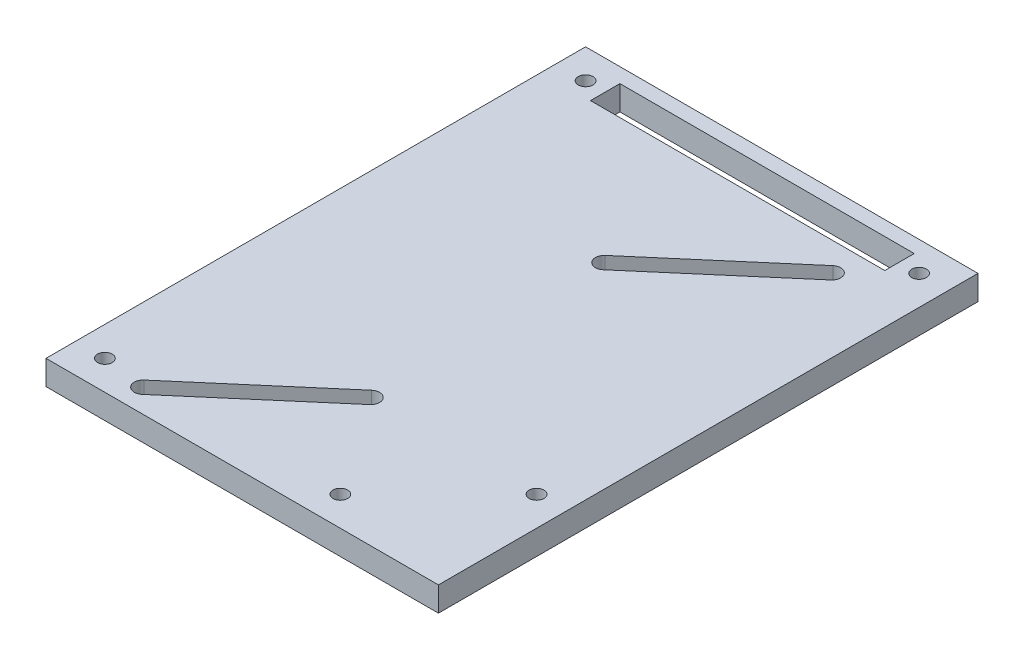
ISO-10303-21;
HEADER;
FILE_DESCRIPTION(('STEP AP214'),'2;1');
FILE_NAME('part.step','',(''),(''),'','','');
FILE_SCHEMA(('AUTOMOTIVE_DESIGN { 1 0 10303 214 1 1 1 1 }'));
ENDSEC;
DATA;
#1=APPLICATION_CONTEXT('core data for automotive mechanical design processes');
#2=APPLICATION_PROTOCOL_DEFINITION('international standard','automotive_design',2000,#1);
#3=PRODUCT_CONTEXT('',#1,'mechanical');
#4=PRODUCT('Part','Part','',(#3));
#5=PRODUCT_RELATED_PRODUCT_CATEGORY('part','',(#4));
#6=PRODUCT_DEFINITION_FORMATION('','',#4);
#7=PRODUCT_DEFINITION_CONTEXT('part definition',#1,'design');
#8=PRODUCT_DEFINITION('design','',#6,#7);
#9=PRODUCT_DEFINITION_SHAPE('','',#8);
#10=(LENGTH_UNIT() NAMED_UNIT(*) SI_UNIT(.MILLI.,.METRE.));
#11=(NAMED_UNIT(*) PLANE_ANGLE_UNIT() SI_UNIT($,.RADIAN.));
#12=(NAMED_UNIT(*) SI_UNIT($,.STERADIAN.) SOLID_ANGLE_UNIT());
#13=UNCERTAINTY_MEASURE_WITH_UNIT(LENGTH_MEASURE(1.E-05),#10,'distance_accuracy_value','');
#14=(GEOMETRIC_REPRESENTATION_CONTEXT(3) GLOBAL_UNCERTAINTY_ASSIGNED_CONTEXT((#13)) GLOBAL_UNIT_ASSIGNED_CONTEXT((#10,
#11,#12)) REPRESENTATION_CONTEXT('',''));
#15=CARTESIAN_POINT('',(0.,0.,0.));
#16=DIRECTION('',(0.,0.,1.));
#17=DIRECTION('',(1.,0.,0.));
#18=AXIS2_PLACEMENT_3D('',#15,#16,#17);
#19=CARTESIAN_POINT('',(-50.8,6.35,63.5));
#20=DIRECTION('',(1.,0.,0.));
#21=DIRECTION('',(0.,0.,-1.));
#22=AXIS2_PLACEMENT_3D('',#19,#20,#21);
#23=PLANE('',#22);
#24=DIRECTION('',(0.,0.,1.));
#25=VECTOR('',#24,1.);
#26=CARTESIAN_POINT('',(-50.8,0.,63.5));
#27=LINE('',#26,#25);
#28=CARTESIAN_POINT('',(-50.8,0.,-76.2));
#29=VERTEX_POINT('',#28);
#30=CARTESIAN_POINT('',(-50.8,0.,63.5));
#31=VERTEX_POINT('',#30);
#32=EDGE_CURVE('E213',#29,#31,#27,.T.);
#33=ORIENTED_EDGE('',*,*,#32,.T.);
#34=DIRECTION('',(0.,-1.,0.));
#35=VECTOR('',#34,1.);
#36=CARTESIAN_POINT('',(-50.8,6.35,63.5));
#37=LINE('',#36,#35);
#38=CARTESIAN_POINT('',(-50.8,6.35,63.5));
#39=VERTEX_POINT('',#38);
#40=EDGE_CURVE('E11',#39,#31,#37,.T.);
#41=ORIENTED_EDGE('',*,*,#40,.F.);
#42=DIRECTION('',(0.,0.,1.));
#43=VECTOR('',#42,1.);
#44=CARTESIAN_POINT('',(-50.8,6.35,63.5));
#45=LINE('',#44,#43);
#46=CARTESIAN_POINT('',(-50.8,6.35,-76.2));
#47=VERTEX_POINT('',#46);
#48=EDGE_CURVE('E250',#47,#39,#45,.T.);
#49=ORIENTED_EDGE('',*,*,#48,.F.);
#50=DIRECTION('',(0.,-1.,0.));
#51=VECTOR('',#50,1.);
#52=CARTESIAN_POINT('',(-50.8,6.35,-76.2));
#53=LINE('',#52,#51);
#54=EDGE_CURVE('E260',#47,#29,#53,.T.);
#55=ORIENTED_EDGE('',*,*,#54,.T.);
#56=EDGE_LOOP('',(#33,#41,#49,#55));
#57=FACE_BOUND('',#56,.T.);
#58=ADVANCED_FACE('F33',(#57),#23,.F.);
#59=CARTESIAN_POINT('',(-50.8,6.35,63.5));
#60=DIRECTION('',(0.,0.,-1.));
#61=DIRECTION('',(-1.,0.,0.));
#62=AXIS2_PLACEMENT_3D('',#59,#60,#61);
#63=PLANE('',#62);
#64=DIRECTION('',(1.,0.,0.));
#65=VECTOR('',#64,1.);
#66=CARTESIAN_POINT('',(-50.8,0.,63.5));
#67=LINE('',#66,#65);
#68=CARTESIAN_POINT('',(50.8,0.,63.5));
#69=VERTEX_POINT('',#68);
#70=EDGE_CURVE('E263',#31,#69,#67,.T.);
#71=ORIENTED_EDGE('',*,*,#70,.T.);
#72=DIRECTION('',(0.,-1.,0.));
#73=VECTOR('',#72,1.);
#74=CARTESIAN_POINT('',(50.8,6.35,63.5));
#75=LINE('',#74,#73);
#76=CARTESIAN_POINT('',(50.8,6.35,63.5));
#77=VERTEX_POINT('',#76);
#78=EDGE_CURVE('E40',#77,#69,#75,.T.);
#79=ORIENTED_EDGE('',*,*,#78,.F.);
#80=DIRECTION('',(1.,0.,0.));
#81=VECTOR('',#80,1.);
#82=CARTESIAN_POINT('',(-50.8,6.35,63.5));
#83=LINE('',#82,#81);
#84=EDGE_CURVE('E253',#39,#77,#83,.T.);
#85=ORIENTED_EDGE('',*,*,#84,.F.);
#86=ORIENTED_EDGE('',*,*,#40,.T.);
#87=EDGE_LOOP('',(#71,#79,#85,#86));
#88=FACE_BOUND('',#87,.T.);
#89=ADVANCED_FACE('F292',(#88),#63,.F.);
#90=CARTESIAN_POINT('',(50.8,6.35,63.5));
#91=DIRECTION('',(-1.,0.,0.));
#92=DIRECTION('',(0.,0.,1.));
#93=AXIS2_PLACEMENT_3D('',#90,#91,#92);
#94=PLANE('',#93);
#95=DIRECTION('',(0.,0.,-1.));
#96=VECTOR('',#95,1.);
#97=CARTESIAN_POINT('',(50.8,0.,63.5));
#98=LINE('',#97,#96);
#99=CARTESIAN_POINT('',(50.8,0.,-76.2));
#100=VERTEX_POINT('',#99);
#101=EDGE_CURVE('E265',#69,#100,#98,.T.);
#102=ORIENTED_EDGE('',*,*,#101,.T.);
#103=DIRECTION('',(0.,-1.,0.));
#104=VECTOR('',#103,1.);
#105=CARTESIAN_POINT('',(50.8,6.35,-76.2));
#106=LINE('',#105,#104);
#107=CARTESIAN_POINT('',(50.8,6.35,-76.2));
#108=VERTEX_POINT('',#107);
#109=EDGE_CURVE('E270',#108,#100,#106,.T.);
#110=ORIENTED_EDGE('',*,*,#109,.F.);
#111=DIRECTION('',(0.,0.,-1.));
#112=VECTOR('',#111,1.);
#113=CARTESIAN_POINT('',(50.8,6.35,63.5));
#114=LINE('',#113,#112);
#115=EDGE_CURVE('E256',#77,#108,#114,.T.);
#116=ORIENTED_EDGE('',*,*,#115,.F.);
#117=ORIENTED_EDGE('',*,*,#78,.T.);
#118=EDGE_LOOP('',(#102,#110,#116,#117));
#119=FACE_BOUND('',#118,.T.);
#120=ADVANCED_FACE('F277',(#119),#94,.F.);
#121=CARTESIAN_POINT('',(-50.8,6.35,-76.2));
#122=DIRECTION('',(0.,0.,1.));
#123=DIRECTION('',(1.,0.,0.));
#124=AXIS2_PLACEMENT_3D('',#121,#122,#123);
#125=PLANE('',#124);
#126=DIRECTION('',(-1.,0.,0.));
#127=VECTOR('',#126,1.);
#128=CARTESIAN_POINT('',(-50.8,0.,-76.2));
#129=LINE('',#128,#127);
#130=EDGE_CURVE('E254',#100,#29,#129,.T.);
#131=ORIENTED_EDGE('',*,*,#130,.T.);
#132=ORIENTED_EDGE('',*,*,#54,.F.);
#133=DIRECTION('',(-1.,0.,0.));
#134=VECTOR('',#133,1.);
#135=CARTESIAN_POINT('',(-50.8,6.35,-76.2));
#136=LINE('',#135,#134);
#137=EDGE_CURVE('E258',#108,#47,#136,.T.);
#138=ORIENTED_EDGE('',*,*,#137,.F.);
#139=ORIENTED_EDGE('',*,*,#109,.T.);
#140=EDGE_LOOP('',(#131,#132,#138,#139));
#141=FACE_BOUND('',#140,.T.);
#142=ADVANCED_FACE('F285',(#141),#125,.F.);
#143=CARTESIAN_POINT('',(0.,6.35,0.));
#144=DIRECTION('',(0.,-1.,0.));
#145=DIRECTION('',(0.,0.,-1.));
#146=AXIS2_PLACEMENT_3D('',#143,#144,#145);
#147=PLANE('',#146);
#148=CARTESIAN_POINT('',(43.18,6.35,-68.58));
#149=DIRECTION('',(0.,1.,0.));
#150=DIRECTION('',(0.,0.,-1.));
#151=AXIS2_PLACEMENT_3D('',#148,#149,#150);
#152=CIRCLE('',#151,1.905);
#153=CARTESIAN_POINT('',(43.18,6.35,-70.485));
#154=VERTEX_POINT('',#153);
#155=EDGE_CURVE('E393',#154,#154,#152,.T.);
#156=ORIENTED_EDGE('',*,*,#155,.F.);
#157=EDGE_LOOP('',(#156));
#158=FACE_BOUND('',#157,.T.);
#159=CARTESIAN_POINT('',(-43.18,6.35,55.88));
#160=DIRECTION('',(0.,1.,0.));
#161=DIRECTION('',(0.,0.,1.));
#162=AXIS2_PLACEMENT_3D('',#159,#160,#161);
#163=CIRCLE('',#162,1.905);
#164=CARTESIAN_POINT('',(-43.18,6.35,57.785));
#165=VERTEX_POINT('',#164);
#166=EDGE_CURVE('E382',#165,#165,#163,.T.);
#167=ORIENTED_EDGE('',*,*,#166,.F.);
#168=EDGE_LOOP('',(#167));
#169=FACE_BOUND('',#168,.T.);
#170=CARTESIAN_POINT('',(17.78,6.35,55.88));
#171=DIRECTION('',(0.,1.,0.));
#172=DIRECTION('',(0.,0.,1.));
#173=AXIS2_PLACEMENT_3D('',#170,#171,#172);
#174=CIRCLE('',#173,1.905);
#175=CARTESIAN_POINT('',(17.78,6.35,57.785));
#176=VERTEX_POINT('',#175);
#177=EDGE_CURVE('E378',#176,#176,#174,.T.);
#178=ORIENTED_EDGE('',*,*,#177,.F.);
#179=EDGE_LOOP('',(#178));
#180=FACE_BOUND('',#179,.T.);
#181=CARTESIAN_POINT('',(43.18,6.35,30.48));
#182=DIRECTION('',(0.,1.,0.));
#183=DIRECTION('',(0.,0.,-1.));
#184=AXIS2_PLACEMENT_3D('',#181,#182,#183);
#185=CIRCLE('',#184,1.905);
#186=CARTESIAN_POINT('',(43.18,6.35,28.575));
#187=VERTEX_POINT('',#186);
#188=EDGE_CURVE('E385',#187,#187,#185,.T.);
#189=ORIENTED_EDGE('',*,*,#188,.F.);
#190=EDGE_LOOP('',(#189));
#191=FACE_BOUND('',#190,.T.);
#192=CARTESIAN_POINT('',(-43.18,6.35,-68.58));
#193=DIRECTION('',(0.,1.,0.));
#194=DIRECTION('',(0.,0.,1.));
#195=AXIS2_PLACEMENT_3D('',#192,#193,#194);
#196=CIRCLE('',#195,1.905);
#197=CARTESIAN_POINT('',(-43.18,6.35,-66.675));
#198=VERTEX_POINT('',#197);
#199=EDGE_CURVE('E169',#198,#198,#196,.T.);
#200=ORIENTED_EDGE('',*,*,#199,.F.);
#201=EDGE_LOOP('',(#200));
#202=FACE_BOUND('',#201,.T.);
#203=DIRECTION('',(-1.,0.,0.));
#204=VECTOR('',#203,1.);
#205=CARTESIAN_POINT('',(-38.1,6.35,-72.39));
#206=LINE('',#205,#204);
#207=CARTESIAN_POINT('',(38.1,6.35,-72.39));
#208=VERTEX_POINT('',#207);
#209=CARTESIAN_POINT('',(-38.1,6.35,-72.39));
#210=VERTEX_POINT('',#209);
#211=EDGE_CURVE('E175',#208,#210,#206,.T.);
#212=ORIENTED_EDGE('',*,*,#211,.F.);
#213=DIRECTION('',(0.,0.,-1.));
#214=VECTOR('',#213,1.);
#215=CARTESIAN_POINT('',(38.1,6.35,-64.77));
#216=LINE('',#215,#214);
#217=CARTESIAN_POINT('',(38.1,6.35,-64.77));
#218=VERTEX_POINT('',#217);
#219=EDGE_CURVE('E47',#218,#208,#216,.T.);
#220=ORIENTED_EDGE('',*,*,#219,.F.);
#221=DIRECTION('',(1.,0.,0.));
#222=VECTOR('',#221,1.);
#223=CARTESIAN_POINT('',(-38.1,6.35,-64.77));
#224=LINE('',#223,#222);
#225=CARTESIAN_POINT('',(-38.1,6.35,-64.77));
#226=VERTEX_POINT('',#225);
#227=EDGE_CURVE('E163',#226,#218,#224,.T.);
#228=ORIENTED_EDGE('',*,*,#227,.F.);
#229=DIRECTION('',(0.,0.,1.));
#230=VECTOR('',#229,1.);
#231=CARTESIAN_POINT('',(-38.1,6.35,-64.77));
#232=LINE('',#231,#230);
#233=EDGE_CURVE('E166',#210,#226,#232,.T.);
#234=ORIENTED_EDGE('',*,*,#233,.F.);
#235=EDGE_LOOP('',(#212,#220,#228,#234));
#236=FACE_BOUND('',#235,.T.);
#237=DIRECTION('',(0.759685436236599,0.,-0.650290733418529));
#238=VECTOR('',#237,1.);
#239=CARTESIAN_POINT('',(1.48656461659475,6.35,-28.4893590927631));
#240=LINE('',#239,#238);
#241=CARTESIAN_POINT('',(1.48656461659475,6.35,-28.4893590927631));
#242=VERTEX_POINT('',#241);
#243=CARTESIAN_POINT('',(33.2365646165948,6.35,-55.6673590927631));
#244=VERTEX_POINT('',#243);
#245=EDGE_CURVE('E202',#242,#244,#240,.T.);
#246=ORIENTED_EDGE('',*,*,#245,.F.);
#247=CARTESIAN_POINT('',(0.,6.35,-30.226));
#248=DIRECTION('',(0.,1.,0.));
#249=DIRECTION('',(0.,0.,1.));
#250=AXIS2_PLACEMENT_3D('',#247,#248,#249);
#251=CIRCLE('',#250,2.28599999999999);
#252=CARTESIAN_POINT('',(-1.48656461659475,6.35,-31.9626409072369));
#253=VERTEX_POINT('',#252);
#254=EDGE_CURVE('E200',#253,#242,#251,.T.);
#255=ORIENTED_EDGE('',*,*,#254,.F.);
#256=DIRECTION('',(-0.759685436236599,0.,0.650290733418529));
#257=VECTOR('',#256,1.);
#258=CARTESIAN_POINT('',(-1.48656461659475,6.35,-31.9626409072369));
#259=LINE('',#258,#257);
#260=CARTESIAN_POINT('',(30.2634353834052,6.35,-59.1406409072369));
#261=VERTEX_POINT('',#260);
#262=EDGE_CURVE('E190',#261,#253,#259,.T.);
#263=ORIENTED_EDGE('',*,*,#262,.F.);
#264=CARTESIAN_POINT('',(31.75,6.35,-57.404));
#265=DIRECTION('',(0.,1.,0.));
#266=DIRECTION('',(0.,0.,1.));
#267=AXIS2_PLACEMENT_3D('',#264,#265,#266);
#268=CIRCLE('',#267,2.28600000000001);
#269=EDGE_CURVE('E206',#244,#261,#268,.T.);
#270=ORIENTED_EDGE('',*,*,#269,.F.);
#271=EDGE_LOOP('',(#246,#255,#263,#270));
#272=FACE_BOUND('',#271,.T.);
#273=DIRECTION('',(-0.75968543623666,0.,0.650290733418458));
#274=VECTOR('',#273,1.);
#275=CARTESIAN_POINT('',(-1.48656461659495,6.35,28.4893590927631));
#276=LINE('',#275,#274);
#277=CARTESIAN_POINT('',(-1.48656461659495,6.35,28.4893590927631));
#278=VERTEX_POINT('',#277);
#279=CARTESIAN_POINT('',(-33.2365646165973,6.35,55.6673590927601));
#280=VERTEX_POINT('',#279);
#281=EDGE_CURVE('E235',#278,#280,#276,.T.);
#282=ORIENTED_EDGE('',*,*,#281,.F.);
#283=CARTESIAN_POINT('',(-2.11067029895745E-13,6.35,30.226));
#284=DIRECTION('',(0.,1.,0.));
#285=DIRECTION('',(0.,0.,1.));
#286=AXIS2_PLACEMENT_3D('',#283,#284,#285);
#287=CIRCLE('',#286,2.28599999999999);
#288=CARTESIAN_POINT('',(1.48656461659453,6.35,31.9626409072369));
#289=VERTEX_POINT('',#288);
#290=EDGE_CURVE('E182',#289,#278,#287,.T.);
#291=ORIENTED_EDGE('',*,*,#290,.F.);
#292=DIRECTION('',(0.759685436236659,0.,-0.650290733418459));
#293=VECTOR('',#292,1.);
#294=CARTESIAN_POINT('',(1.48656461659453,6.35,31.9626409072369));
#295=LINE('',#294,#293);
#296=CARTESIAN_POINT('',(-30.2634353834081,6.35,59.1406409072341));
#297=VERTEX_POINT('',#296);
#298=EDGE_CURVE('E224',#297,#289,#295,.T.);
#299=ORIENTED_EDGE('',*,*,#298,.F.);
#300=CARTESIAN_POINT('',(-31.7500000000027,6.35,57.4039999999971));
#301=DIRECTION('',(0.,1.,0.));
#302=DIRECTION('',(0.,0.,1.));
#303=AXIS2_PLACEMENT_3D('',#300,#301,#302);
#304=CIRCLE('',#303,2.28600000000001);
#305=EDGE_CURVE('E238',#280,#297,#304,.T.);
#306=ORIENTED_EDGE('',*,*,#305,.F.);
#307=EDGE_LOOP('',(#282,#291,#299,#306));
#308=FACE_BOUND('',#307,.T.);
#309=ORIENTED_EDGE('',*,*,#48,.T.);
#310=ORIENTED_EDGE('',*,*,#84,.T.);
#311=ORIENTED_EDGE('',*,*,#115,.T.);
#312=ORIENTED_EDGE('',*,*,#137,.T.);
#313=EDGE_LOOP('',(#309,#310,#311,#312));
#314=FACE_BOUND('',#313,.T.);
#315=ADVANCED_FACE('F291',(#158,#169,#180,#191,#202,#236,#272,#308,#314),#147,.F.);
#316=CARTESIAN_POINT('',(0.,0.,0.));
#317=DIRECTION('',(0.,-1.,0.));
#318=DIRECTION('',(0.,0.,-1.));
#319=AXIS2_PLACEMENT_3D('',#316,#317,#318);
#320=PLANE('',#319);
#321=CARTESIAN_POINT('',(43.18,0.,-68.58));
#322=DIRECTION('',(0.,1.,0.));
#323=DIRECTION('',(0.,0.,-1.));
#324=AXIS2_PLACEMENT_3D('',#321,#322,#323);
#325=CIRCLE('',#324,1.905);
#326=CARTESIAN_POINT('',(43.18,0.,-70.485));
#327=VERTEX_POINT('',#326);
#328=EDGE_CURVE('E390',#327,#327,#325,.T.);
#329=ORIENTED_EDGE('',*,*,#328,.T.);
#330=EDGE_LOOP('',(#329));
#331=FACE_BOUND('',#330,.T.);
#332=CARTESIAN_POINT('',(-43.18,0.,55.88));
#333=DIRECTION('',(0.,1.,0.));
#334=DIRECTION('',(0.,0.,1.));
#335=AXIS2_PLACEMENT_3D('',#332,#333,#334);
#336=CIRCLE('',#335,1.905);
#337=CARTESIAN_POINT('',(-43.18,0.,57.785));
#338=VERTEX_POINT('',#337);
#339=EDGE_CURVE('E396',#338,#338,#336,.T.);
#340=ORIENTED_EDGE('',*,*,#339,.T.);
#341=EDGE_LOOP('',(#340));
#342=FACE_BOUND('',#341,.T.);
#343=CARTESIAN_POINT('',(17.78,0.,55.88));
#344=DIRECTION('',(0.,1.,0.));
#345=DIRECTION('',(0.,0.,1.));
#346=AXIS2_PLACEMENT_3D('',#343,#344,#345);
#347=CIRCLE('',#346,1.905);
#348=CARTESIAN_POINT('',(17.78,0.,57.785));
#349=VERTEX_POINT('',#348);
#350=EDGE_CURVE('E375',#349,#349,#347,.T.);
#351=ORIENTED_EDGE('',*,*,#350,.T.);
#352=EDGE_LOOP('',(#351));
#353=FACE_BOUND('',#352,.T.);
#354=CARTESIAN_POINT('',(43.18,0.,30.48));
#355=DIRECTION('',(0.,1.,0.));
#356=DIRECTION('',(0.,0.,-1.));
#357=AXIS2_PLACEMENT_3D('',#354,#355,#356);
#358=CIRCLE('',#357,1.905);
#359=CARTESIAN_POINT('',(43.18,0.,28.575));
#360=VERTEX_POINT('',#359);
#361=EDGE_CURVE('E380',#360,#360,#358,.T.);
#362=ORIENTED_EDGE('',*,*,#361,.T.);
#363=EDGE_LOOP('',(#362));
#364=FACE_BOUND('',#363,.T.);
#365=CARTESIAN_POINT('',(-43.18,0.,-68.58));
#366=DIRECTION('',(0.,1.,0.));
#367=DIRECTION('',(0.,0.,1.));
#368=AXIS2_PLACEMENT_3D('',#365,#366,#367);
#369=CIRCLE('',#368,1.905);
#370=CARTESIAN_POINT('',(-43.18,0.,-66.675));
#371=VERTEX_POINT('',#370);
#372=EDGE_CURVE('E176',#371,#371,#369,.T.);
#373=ORIENTED_EDGE('',*,*,#372,.T.);
#374=EDGE_LOOP('',(#373));
#375=FACE_BOUND('',#374,.T.);
#376=DIRECTION('',(0.,0.,-1.));
#377=VECTOR('',#376,1.);
#378=CARTESIAN_POINT('',(38.1,0.,-64.77));
#379=LINE('',#378,#377);
#380=CARTESIAN_POINT('',(38.1,0.,-64.77));
#381=VERTEX_POINT('',#380);
#382=CARTESIAN_POINT('',(38.1,0.,-72.39));
#383=VERTEX_POINT('',#382);
#384=EDGE_CURVE('E147',#381,#383,#379,.T.);
#385=ORIENTED_EDGE('',*,*,#384,.T.);
#386=DIRECTION('',(-1.,0.,0.));
#387=VECTOR('',#386,1.);
#388=CARTESIAN_POINT('',(-38.1,0.,-72.39));
#389=LINE('',#388,#387);
#390=CARTESIAN_POINT('',(-38.1,0.,-72.39));
#391=VERTEX_POINT('',#390);
#392=EDGE_CURVE('E156',#383,#391,#389,.T.);
#393=ORIENTED_EDGE('',*,*,#392,.T.);
#394=DIRECTION('',(0.,0.,1.));
#395=VECTOR('',#394,1.);
#396=CARTESIAN_POINT('',(-38.1,0.,-64.77));
#397=LINE('',#396,#395);
#398=CARTESIAN_POINT('',(-38.1,0.,-64.77));
#399=VERTEX_POINT('',#398);
#400=EDGE_CURVE('E55',#391,#399,#397,.T.);
#401=ORIENTED_EDGE('',*,*,#400,.T.);
#402=DIRECTION('',(1.,0.,0.));
#403=VECTOR('',#402,1.);
#404=CARTESIAN_POINT('',(-38.1,0.,-64.77));
#405=LINE('',#404,#403);
#406=EDGE_CURVE('E153',#399,#381,#405,.T.);
#407=ORIENTED_EDGE('',*,*,#406,.T.);
#408=EDGE_LOOP('',(#385,#393,#401,#407));
#409=FACE_BOUND('',#408,.T.);
#410=CARTESIAN_POINT('',(0.,0.,-30.226));
#411=DIRECTION('',(0.,1.,0.));
#412=DIRECTION('',(0.,0.,1.));
#413=AXIS2_PLACEMENT_3D('',#410,#411,#412);
#414=CIRCLE('',#413,2.28599999999999);
#415=CARTESIAN_POINT('',(-1.48656461659475,0.,-31.9626409072369));
#416=VERTEX_POINT('',#415);
#417=CARTESIAN_POINT('',(1.48656461659475,0.,-28.4893590927631));
#418=VERTEX_POINT('',#417);
#419=EDGE_CURVE('E186',#416,#418,#414,.T.);
#420=ORIENTED_EDGE('',*,*,#419,.T.);
#421=DIRECTION('',(0.759685436236599,0.,-0.650290733418529));
#422=VECTOR('',#421,1.);
#423=CARTESIAN_POINT('',(1.48656461659475,0.,-28.4893590927631));
#424=LINE('',#423,#422);
#425=CARTESIAN_POINT('',(33.2365646165948,0.,-55.6673590927631));
#426=VERTEX_POINT('',#425);
#427=EDGE_CURVE('E189',#418,#426,#424,.T.);
#428=ORIENTED_EDGE('',*,*,#427,.T.);
#429=CARTESIAN_POINT('',(31.75,0.,-57.404));
#430=DIRECTION('',(0.,1.,0.));
#431=DIRECTION('',(0.,0.,1.));
#432=AXIS2_PLACEMENT_3D('',#429,#430,#431);
#433=CIRCLE('',#432,2.28600000000001);
#434=CARTESIAN_POINT('',(30.2634353834052,0.,-59.1406409072369));
#435=VERTEX_POINT('',#434);
#436=EDGE_CURVE('E193',#426,#435,#433,.T.);
#437=ORIENTED_EDGE('',*,*,#436,.T.);
#438=DIRECTION('',(-0.759685436236599,0.,0.650290733418529));
#439=VECTOR('',#438,1.);
#440=CARTESIAN_POINT('',(-1.48656461659475,0.,-31.9626409072369));
#441=LINE('',#440,#439);
#442=EDGE_CURVE('E196',#435,#416,#441,.T.);
#443=ORIENTED_EDGE('',*,*,#442,.T.);
#444=EDGE_LOOP('',(#420,#428,#437,#443));
#445=FACE_BOUND('',#444,.T.);
#446=CARTESIAN_POINT('',(-2.11067029895745E-13,0.,30.226));
#447=DIRECTION('',(0.,1.,0.));
#448=DIRECTION('',(0.,0.,1.));
#449=AXIS2_PLACEMENT_3D('',#446,#447,#448);
#450=CIRCLE('',#449,2.28599999999999);
#451=CARTESIAN_POINT('',(1.48656461659453,0.,31.9626409072369));
#452=VERTEX_POINT('',#451);
#453=CARTESIAN_POINT('',(-1.48656461659495,0.,28.4893590927631));
#454=VERTEX_POINT('',#453);
#455=EDGE_CURVE('E220',#452,#454,#450,.T.);
#456=ORIENTED_EDGE('',*,*,#455,.T.);
#457=DIRECTION('',(-0.75968543623666,0.,0.650290733418458));
#458=VECTOR('',#457,1.);
#459=CARTESIAN_POINT('',(-1.48656461659495,0.,28.4893590927631));
#460=LINE('',#459,#458);
#461=CARTESIAN_POINT('',(-33.2365646165973,0.,55.6673590927601));
#462=VERTEX_POINT('',#461);
#463=EDGE_CURVE('E223',#454,#462,#460,.T.);
#464=ORIENTED_EDGE('',*,*,#463,.T.);
#465=CARTESIAN_POINT('',(-31.7500000000027,0.,57.4039999999971));
#466=DIRECTION('',(0.,1.,0.));
#467=DIRECTION('',(0.,0.,1.));
#468=AXIS2_PLACEMENT_3D('',#465,#466,#467);
#469=CIRCLE('',#468,2.28600000000001);
#470=CARTESIAN_POINT('',(-30.2634353834081,0.,59.1406409072341));
#471=VERTEX_POINT('',#470);
#472=EDGE_CURVE('E227',#462,#471,#469,.T.);
#473=ORIENTED_EDGE('',*,*,#472,.T.);
#474=DIRECTION('',(0.759685436236659,0.,-0.650290733418459));
#475=VECTOR('',#474,1.);
#476=CARTESIAN_POINT('',(1.48656461659453,0.,31.9626409072369));
#477=LINE('',#476,#475);
#478=EDGE_CURVE('E230',#471,#452,#477,.T.);
#479=ORIENTED_EDGE('',*,*,#478,.T.);
#480=EDGE_LOOP('',(#456,#464,#473,#479));
#481=FACE_BOUND('',#480,.T.);
#482=ORIENTED_EDGE('',*,*,#32,.F.);
#483=ORIENTED_EDGE('',*,*,#130,.F.);
#484=ORIENTED_EDGE('',*,*,#101,.F.);
#485=ORIENTED_EDGE('',*,*,#70,.F.);
#486=EDGE_LOOP('',(#482,#483,#484,#485));
#487=FACE_BOUND('',#486,.T.);
#488=ADVANCED_FACE('F160',(#331,#342,#353,#364,#375,#409,#445,#481,#487),#320,.T.);
#489=CARTESIAN_POINT('',(-2.11067029895745E-13,0.,30.226));
#490=DIRECTION('',(0.,1.,0.));
#491=DIRECTION('',(0.,0.,1.));
#492=AXIS2_PLACEMENT_3D('',#489,#490,#491);
#493=CYLINDRICAL_SURFACE('',#492,2.28599999999999);
#494=ORIENTED_EDGE('',*,*,#290,.T.);
#495=DIRECTION('',(0.,1.,0.));
#496=VECTOR('',#495,1.);
#497=CARTESIAN_POINT('',(-1.48656461659495,0.,28.4893590927631));
#498=LINE('',#497,#496);
#499=EDGE_CURVE('E233',#454,#278,#498,.T.);
#500=ORIENTED_EDGE('',*,*,#499,.F.);
#501=ORIENTED_EDGE('',*,*,#455,.F.);
#502=DIRECTION('',(0.,1.,0.));
#503=VECTOR('',#502,1.);
#504=CARTESIAN_POINT('',(1.48656461659453,0.,31.9626409072369));
#505=LINE('',#504,#503);
#506=EDGE_CURVE('E203',#452,#289,#505,.T.);
#507=ORIENTED_EDGE('',*,*,#506,.T.);
#508=EDGE_LOOP('',(#494,#500,#501,#507));
#509=FACE_BOUND('',#508,.T.);
#510=ADVANCED_FACE('F304',(#509),#493,.F.);
#511=CARTESIAN_POINT('',(1.48656461659453,0.,31.9626409072369));
#512=DIRECTION('',(0.650290733418459,0.,0.759685436236659));
#513=DIRECTION('',(0.759685436236659,0.,-0.650290733418459));
#514=AXIS2_PLACEMENT_3D('',#511,#512,#513);
#515=PLANE('',#514);
#516=ORIENTED_EDGE('',*,*,#298,.T.);
#517=ORIENTED_EDGE('',*,*,#506,.F.);
#518=ORIENTED_EDGE('',*,*,#478,.F.);
#519=DIRECTION('',(0.,1.,0.));
#520=VECTOR('',#519,1.);
#521=CARTESIAN_POINT('',(-30.2634353834081,0.,59.1406409072341));
#522=LINE('',#521,#520);
#523=EDGE_CURVE('E244',#471,#297,#522,.T.);
#524=ORIENTED_EDGE('',*,*,#523,.T.);
#525=EDGE_LOOP('',(#516,#517,#518,#524));
#526=FACE_BOUND('',#525,.T.);
#527=ADVANCED_FACE('F311',(#526),#515,.F.);
#528=CARTESIAN_POINT('',(-31.7500000000027,0.,57.4039999999971));
#529=DIRECTION('',(0.,1.,0.));
#530=DIRECTION('',(0.,0.,1.));
#531=AXIS2_PLACEMENT_3D('',#528,#529,#530);
#532=CYLINDRICAL_SURFACE('',#531,2.28600000000001);
#533=ORIENTED_EDGE('',*,*,#305,.T.);
#534=ORIENTED_EDGE('',*,*,#523,.F.);
#535=ORIENTED_EDGE('',*,*,#472,.F.);
#536=DIRECTION('',(0.,1.,0.));
#537=VECTOR('',#536,1.);
#538=CARTESIAN_POINT('',(-33.2365646165973,0.,55.6673590927601));
#539=LINE('',#538,#537);
#540=EDGE_CURVE('E246',#462,#280,#539,.T.);
#541=ORIENTED_EDGE('',*,*,#540,.T.);
#542=EDGE_LOOP('',(#533,#534,#535,#541));
#543=FACE_BOUND('',#542,.T.);
#544=ADVANCED_FACE('F317',(#543),#532,.F.);
#545=CARTESIAN_POINT('',(-1.48656461659495,0.,28.4893590927631));
#546=DIRECTION('',(-0.650290733418458,0.,-0.75968543623666));
#547=DIRECTION('',(-0.75968543623666,0.,0.650290733418458));
#548=AXIS2_PLACEMENT_3D('',#545,#546,#547);
#549=PLANE('',#548);
#550=ORIENTED_EDGE('',*,*,#281,.T.);
#551=ORIENTED_EDGE('',*,*,#540,.F.);
#552=ORIENTED_EDGE('',*,*,#463,.F.);
#553=ORIENTED_EDGE('',*,*,#499,.T.);
#554=EDGE_LOOP('',(#550,#551,#552,#553));
#555=FACE_BOUND('',#554,.T.);
#556=ADVANCED_FACE('F313',(#555),#549,.F.);
#557=CARTESIAN_POINT('',(0.,0.,-30.226));
#558=DIRECTION('',(0.,1.,0.));
#559=DIRECTION('',(0.,0.,1.));
#560=AXIS2_PLACEMENT_3D('',#557,#558,#559);
#561=CYLINDRICAL_SURFACE('',#560,2.28599999999999);
#562=ORIENTED_EDGE('',*,*,#254,.T.);
#563=DIRECTION('',(0.,1.,0.));
#564=VECTOR('',#563,1.);
#565=CARTESIAN_POINT('',(1.48656461659475,0.,-28.4893590927631));
#566=LINE('',#565,#564);
#567=EDGE_CURVE('E199',#418,#242,#566,.T.);
#568=ORIENTED_EDGE('',*,*,#567,.F.);
#569=ORIENTED_EDGE('',*,*,#419,.F.);
#570=DIRECTION('',(0.,1.,0.));
#571=VECTOR('',#570,1.);
#572=CARTESIAN_POINT('',(-1.48656461659475,0.,-31.9626409072369));
#573=LINE('',#572,#571);
#574=EDGE_CURVE('E211',#416,#253,#573,.T.);
#575=ORIENTED_EDGE('',*,*,#574,.T.);
#576=EDGE_LOOP('',(#562,#568,#569,#575));
#577=FACE_BOUND('',#576,.T.);
#578=ADVANCED_FACE('F316',(#577),#561,.F.);
#579=CARTESIAN_POINT('',(-1.48656461659475,0.,-31.9626409072369));
#580=DIRECTION('',(-0.650290733418529,0.,-0.759685436236599));
#581=DIRECTION('',(-0.759685436236599,0.,0.650290733418529));
#582=AXIS2_PLACEMENT_3D('',#579,#580,#581);
#583=PLANE('',#582);
#584=ORIENTED_EDGE('',*,*,#262,.T.);
#585=ORIENTED_EDGE('',*,*,#574,.F.);
#586=ORIENTED_EDGE('',*,*,#442,.F.);
#587=DIRECTION('',(0.,1.,0.));
#588=VECTOR('',#587,1.);
#589=CARTESIAN_POINT('',(30.2634353834052,0.,-59.1406409072369));
#590=LINE('',#589,#588);
#591=EDGE_CURVE('E214',#435,#261,#590,.T.);
#592=ORIENTED_EDGE('',*,*,#591,.T.);
#593=EDGE_LOOP('',(#584,#585,#586,#592));
#594=FACE_BOUND('',#593,.T.);
#595=ADVANCED_FACE('F327',(#594),#583,.F.);
#596=CARTESIAN_POINT('',(31.75,0.,-57.404));
#597=DIRECTION('',(0.,1.,0.));
#598=DIRECTION('',(0.,0.,1.));
#599=AXIS2_PLACEMENT_3D('',#596,#597,#598);
#600=CYLINDRICAL_SURFACE('',#599,2.28600000000001);
#601=ORIENTED_EDGE('',*,*,#269,.T.);
#602=ORIENTED_EDGE('',*,*,#591,.F.);
#603=ORIENTED_EDGE('',*,*,#436,.F.);
#604=DIRECTION('',(0.,1.,0.));
#605=VECTOR('',#604,1.);
#606=CARTESIAN_POINT('',(33.2365646165948,0.,-55.6673590927631));
#607=LINE('',#606,#605);
#608=EDGE_CURVE('E216',#426,#244,#607,.T.);
#609=ORIENTED_EDGE('',*,*,#608,.T.);
#610=EDGE_LOOP('',(#601,#602,#603,#609));
#611=FACE_BOUND('',#610,.T.);
#612=ADVANCED_FACE('F332',(#611),#600,.F.);
#613=CARTESIAN_POINT('',(1.48656461659475,0.,-28.4893590927631));
#614=DIRECTION('',(0.650290733418529,0.,0.759685436236599));
#615=DIRECTION('',(0.759685436236599,0.,-0.650290733418529));
#616=AXIS2_PLACEMENT_3D('',#613,#614,#615);
#617=PLANE('',#616);
#618=ORIENTED_EDGE('',*,*,#245,.T.);
#619=ORIENTED_EDGE('',*,*,#608,.F.);
#620=ORIENTED_EDGE('',*,*,#427,.F.);
#621=ORIENTED_EDGE('',*,*,#567,.T.);
#622=EDGE_LOOP('',(#618,#619,#620,#621));
#623=FACE_BOUND('',#622,.T.);
#624=ADVANCED_FACE('F329',(#623),#617,.F.);
#625=CARTESIAN_POINT('',(38.1,0.,-64.77));
#626=DIRECTION('',(1.,0.,0.));
#627=DIRECTION('',(0.,0.,-1.));
#628=AXIS2_PLACEMENT_3D('',#625,#626,#627);
#629=PLANE('',#628);
#630=ORIENTED_EDGE('',*,*,#219,.T.);
#631=DIRECTION('',(0.,1.,0.));
#632=VECTOR('',#631,1.);
#633=CARTESIAN_POINT('',(38.1,0.,-72.39));
#634=LINE('',#633,#632);
#635=EDGE_CURVE('E143',#383,#208,#634,.T.);
#636=ORIENTED_EDGE('',*,*,#635,.F.);
#637=ORIENTED_EDGE('',*,*,#384,.F.);
#638=DIRECTION('',(0.,1.,0.));
#639=VECTOR('',#638,1.);
#640=CARTESIAN_POINT('',(38.1,0.,-64.77));
#641=LINE('',#640,#639);
#642=EDGE_CURVE('E180',#381,#218,#641,.T.);
#643=ORIENTED_EDGE('',*,*,#642,.T.);
#644=EDGE_LOOP('',(#630,#636,#637,#643));
#645=FACE_BOUND('',#644,.T.);
#646=ADVANCED_FACE('F145',(#645),#629,.F.);
#647=CARTESIAN_POINT('',(-38.1,0.,-64.77));
#648=DIRECTION('',(0.,0.,1.));
#649=DIRECTION('',(1.,0.,0.));
#650=AXIS2_PLACEMENT_3D('',#647,#648,#649);
#651=PLANE('',#650);
#652=ORIENTED_EDGE('',*,*,#227,.T.);
#653=ORIENTED_EDGE('',*,*,#642,.F.);
#654=ORIENTED_EDGE('',*,*,#406,.F.);
#655=DIRECTION('',(0.,1.,0.));
#656=VECTOR('',#655,1.);
#657=CARTESIAN_POINT('',(-38.1,0.,-64.77));
#658=LINE('',#657,#656);
#659=EDGE_CURVE('E183',#399,#226,#658,.T.);
#660=ORIENTED_EDGE('',*,*,#659,.T.);
#661=EDGE_LOOP('',(#652,#653,#654,#660));
#662=FACE_BOUND('',#661,.T.);
#663=ADVANCED_FACE('F342',(#662),#651,.F.);
#664=CARTESIAN_POINT('',(-38.1,0.,-64.77));
#665=DIRECTION('',(-1.,0.,0.));
#666=DIRECTION('',(0.,0.,1.));
#667=AXIS2_PLACEMENT_3D('',#664,#665,#666);
#668=PLANE('',#667);
#669=ORIENTED_EDGE('',*,*,#233,.T.);
#670=ORIENTED_EDGE('',*,*,#659,.F.);
#671=ORIENTED_EDGE('',*,*,#400,.F.);
#672=DIRECTION('',(0.,1.,0.));
#673=VECTOR('',#672,1.);
#674=CARTESIAN_POINT('',(-38.1,0.,-72.39));
#675=LINE('',#674,#673);
#676=EDGE_CURVE('E152',#391,#210,#675,.T.);
#677=ORIENTED_EDGE('',*,*,#676,.T.);
#678=EDGE_LOOP('',(#669,#670,#671,#677));
#679=FACE_BOUND('',#678,.T.);
#680=ADVANCED_FACE('F346',(#679),#668,.F.);
#681=CARTESIAN_POINT('',(-38.1,0.,-72.39));
#682=DIRECTION('',(0.,0.,-1.));
#683=DIRECTION('',(-1.,0.,0.));
#684=AXIS2_PLACEMENT_3D('',#681,#682,#683);
#685=PLANE('',#684);
#686=ORIENTED_EDGE('',*,*,#211,.T.);
#687=ORIENTED_EDGE('',*,*,#676,.F.);
#688=ORIENTED_EDGE('',*,*,#392,.F.);
#689=ORIENTED_EDGE('',*,*,#635,.T.);
#690=EDGE_LOOP('',(#686,#687,#688,#689));
#691=FACE_BOUND('',#690,.T.);
#692=ADVANCED_FACE('F157',(#691),#685,.F.);
#693=CARTESIAN_POINT('',(-43.18,0.,-68.58));
#694=DIRECTION('',(0.,1.,0.));
#695=DIRECTION('',(0.,0.,1.));
#696=AXIS2_PLACEMENT_3D('',#693,#694,#695);
#697=CYLINDRICAL_SURFACE('',#696,1.905);
#698=ORIENTED_EDGE('',*,*,#372,.F.);
#699=EDGE_LOOP('',(#698));
#700=FACE_BOUND('',#699,.T.);
#701=ORIENTED_EDGE('',*,*,#199,.T.);
#702=EDGE_LOOP('',(#701));
#703=FACE_BOUND('',#702,.T.);
#704=ADVANCED_FACE('F345',(#700,#703),#697,.F.);
#705=CARTESIAN_POINT('',(43.18,0.,30.48));
#706=DIRECTION('',(0.,1.,0.));
#707=DIRECTION('',(0.,0.,1.));
#708=AXIS2_PLACEMENT_3D('',#705,#706,#707);
#709=CYLINDRICAL_SURFACE('',#708,1.905);
#710=ORIENTED_EDGE('',*,*,#361,.F.);
#711=EDGE_LOOP('',(#710));
#712=FACE_BOUND('',#711,.T.);
#713=ORIENTED_EDGE('',*,*,#188,.T.);
#714=EDGE_LOOP('',(#713));
#715=FACE_BOUND('',#714,.T.);
#716=ADVANCED_FACE('F354',(#712,#715),#709,.F.);
#717=CARTESIAN_POINT('',(17.78,0.,55.88));
#718=DIRECTION('',(0.,1.,0.));
#719=DIRECTION('',(0.,0.,1.));
#720=AXIS2_PLACEMENT_3D('',#717,#718,#719);
#721=CYLINDRICAL_SURFACE('',#720,1.905);
#722=ORIENTED_EDGE('',*,*,#350,.F.);
#723=EDGE_LOOP('',(#722));
#724=FACE_BOUND('',#723,.T.);
#725=ORIENTED_EDGE('',*,*,#177,.T.);
#726=EDGE_LOOP('',(#725));
#727=FACE_BOUND('',#726,.T.);
#728=ADVANCED_FACE('F360',(#724,#727),#721,.F.);
#729=CARTESIAN_POINT('',(-43.18,0.,55.88));
#730=DIRECTION('',(0.,1.,0.));
#731=DIRECTION('',(0.,0.,1.));
#732=AXIS2_PLACEMENT_3D('',#729,#730,#731);
#733=CYLINDRICAL_SURFACE('',#732,1.905);
#734=ORIENTED_EDGE('',*,*,#339,.F.);
#735=EDGE_LOOP('',(#734));
#736=FACE_BOUND('',#735,.T.);
#737=ORIENTED_EDGE('',*,*,#166,.T.);
#738=EDGE_LOOP('',(#737));
#739=FACE_BOUND('',#738,.T.);
#740=ADVANCED_FACE('F356',(#736,#739),#733,.F.);
#741=CARTESIAN_POINT('',(43.18,0.,-68.58));
#742=DIRECTION('',(0.,1.,0.));
#743=DIRECTION('',(0.,0.,1.));
#744=AXIS2_PLACEMENT_3D('',#741,#742,#743);
#745=CYLINDRICAL_SURFACE('',#744,1.905);
#746=ORIENTED_EDGE('',*,*,#328,.F.);
#747=EDGE_LOOP('',(#746));
#748=FACE_BOUND('',#747,.T.);
#749=ORIENTED_EDGE('',*,*,#155,.T.);
#750=EDGE_LOOP('',(#749));
#751=FACE_BOUND('',#750,.T.);
#752=ADVANCED_FACE('F359',(#748,#751),#745,.F.);
#753=CLOSED_SHELL('',(#58,#89,#120,#142,#315,#488,#510,#527,#544,#556,#578,#595,#612,#624,#646,
#663,#680,#692,#704,#716,#728,#740,#752));
#754=MANIFOLD_SOLID_BREP('B2',#753);
#755=ADVANCED_BREP_SHAPE_REPRESENTATION('',(#18,#754),#14);
#756=SHAPE_DEFINITION_REPRESENTATION(#9,#755);
ENDSEC;
END-ISO-10303-21;
